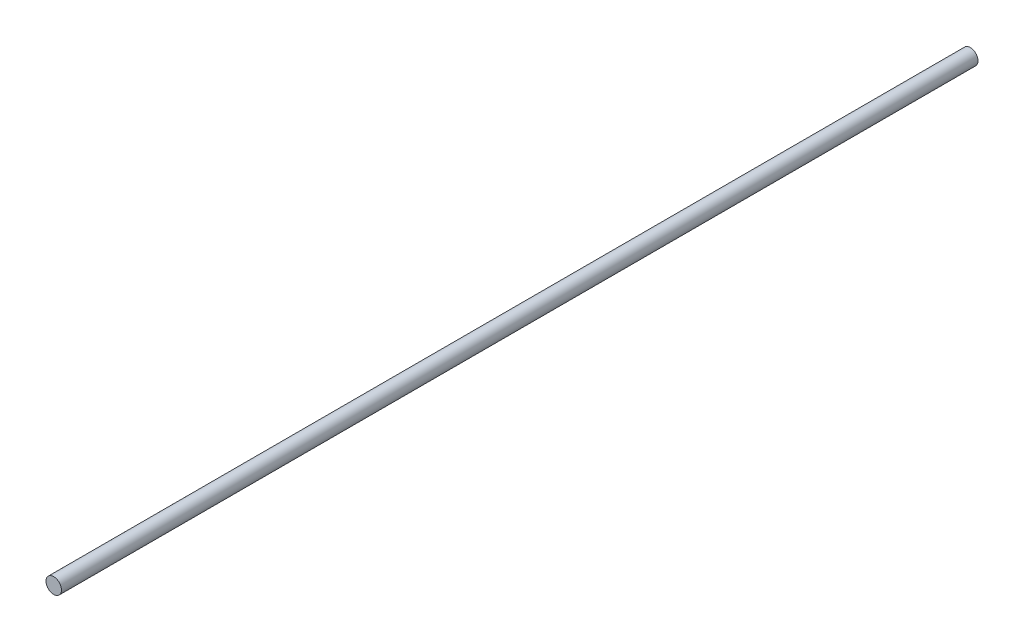
ISO-10303-21;
HEADER;
FILE_DESCRIPTION(('STEP AP214'),'2;1');
FILE_NAME('part.step','',(''),(''),'','','');
FILE_SCHEMA(('AUTOMOTIVE_DESIGN { 1 0 10303 214 1 1 1 1 }'));
ENDSEC;
DATA;
#1=APPLICATION_CONTEXT('core data for automotive mechanical design processes');
#2=APPLICATION_PROTOCOL_DEFINITION('international standard','automotive_design',2000,#1);
#3=PRODUCT_CONTEXT('',#1,'mechanical');
#4=PRODUCT('Part','Part','',(#3));
#5=PRODUCT_RELATED_PRODUCT_CATEGORY('part','',(#4));
#6=PRODUCT_DEFINITION_FORMATION('','',#4);
#7=PRODUCT_DEFINITION_CONTEXT('part definition',#1,'design');
#8=PRODUCT_DEFINITION('design','',#6,#7);
#9=PRODUCT_DEFINITION_SHAPE('','',#8);
#10=(LENGTH_UNIT() NAMED_UNIT(*) SI_UNIT(.MILLI.,.METRE.));
#11=(NAMED_UNIT(*) PLANE_ANGLE_UNIT() SI_UNIT($,.RADIAN.));
#12=(NAMED_UNIT(*) SI_UNIT($,.STERADIAN.) SOLID_ANGLE_UNIT());
#13=UNCERTAINTY_MEASURE_WITH_UNIT(LENGTH_MEASURE(1.E-05),#10,'distance_accuracy_value','');
#14=(GEOMETRIC_REPRESENTATION_CONTEXT(3) GLOBAL_UNCERTAINTY_ASSIGNED_CONTEXT((#13)) GLOBAL_UNIT_ASSIGNED_CONTEXT((#10,
#11,#12)) REPRESENTATION_CONTEXT('',''));
#15=CARTESIAN_POINT('',(0.,0.,0.));
#16=DIRECTION('',(0.,0.,1.));
#17=DIRECTION('',(1.,0.,0.));
#18=AXIS2_PLACEMENT_3D('',#15,#16,#17);
#19=CARTESIAN_POINT('',(0.,0.,356.));
#20=DIRECTION('',(0.,0.,-1.));
#21=DIRECTION('',(-1.,0.,0.));
#22=AXIS2_PLACEMENT_3D('',#19,#20,#21);
#23=CYLINDRICAL_SURFACE('',#22,3.);
#24=CARTESIAN_POINT('',(0.,0.,356.));
#25=DIRECTION('',(0.,0.,1.));
#26=DIRECTION('',(1.,0.,0.));
#27=AXIS2_PLACEMENT_3D('',#24,#25,#26);
#28=CIRCLE('',#27,3.);
#29=CARTESIAN_POINT('',(3.,0.,356.));
#30=VERTEX_POINT('',#29);
#31=EDGE_CURVE('E10',#30,#30,#28,.T.);
#32=ORIENTED_EDGE('',*,*,#31,.F.);
#33=EDGE_LOOP('',(#32));
#34=FACE_BOUND('',#33,.T.);
#35=CARTESIAN_POINT('',(0.,0.,0.));
#36=DIRECTION('',(0.,0.,1.));
#37=DIRECTION('',(1.,0.,0.));
#38=AXIS2_PLACEMENT_3D('',#35,#36,#37);
#39=CIRCLE('',#38,3.);
#40=CARTESIAN_POINT('',(3.,0.,0.));
#41=VERTEX_POINT('',#40);
#42=EDGE_CURVE('E38',#41,#41,#39,.T.);
#43=ORIENTED_EDGE('',*,*,#42,.T.);
#44=EDGE_LOOP('',(#43));
#45=FACE_BOUND('',#44,.T.);
#46=ADVANCED_FACE('F35',(#34,#45),#23,.T.);
#47=CARTESIAN_POINT('',(0.,0.,356.));
#48=DIRECTION('',(0.,0.,1.));
#49=DIRECTION('',(1.,0.,0.));
#50=AXIS2_PLACEMENT_3D('',#47,#48,#49);
#51=PLANE('',#50);
#52=ORIENTED_EDGE('',*,*,#31,.T.);
#53=EDGE_LOOP('',(#52));
#54=FACE_BOUND('',#53,.T.);
#55=ADVANCED_FACE('F50',(#54),#51,.T.);
#56=CARTESIAN_POINT('',(0.,0.,0.));
#57=DIRECTION('',(0.,0.,1.));
#58=DIRECTION('',(1.,0.,0.));
#59=AXIS2_PLACEMENT_3D('',#56,#57,#58);
#60=PLANE('',#59);
#61=ORIENTED_EDGE('',*,*,#42,.F.);
#62=EDGE_LOOP('',(#61));
#63=FACE_BOUND('',#62,.T.);
#64=ADVANCED_FACE('F48',(#63),#60,.F.);
#65=CLOSED_SHELL('',(#46,#55,#64));
#66=MANIFOLD_SOLID_BREP('B2',#65);
#67=ADVANCED_BREP_SHAPE_REPRESENTATION('',(#18,#66),#14);
#68=SHAPE_DEFINITION_REPRESENTATION(#9,#67);
ENDSEC;
END-ISO-10303-21;
